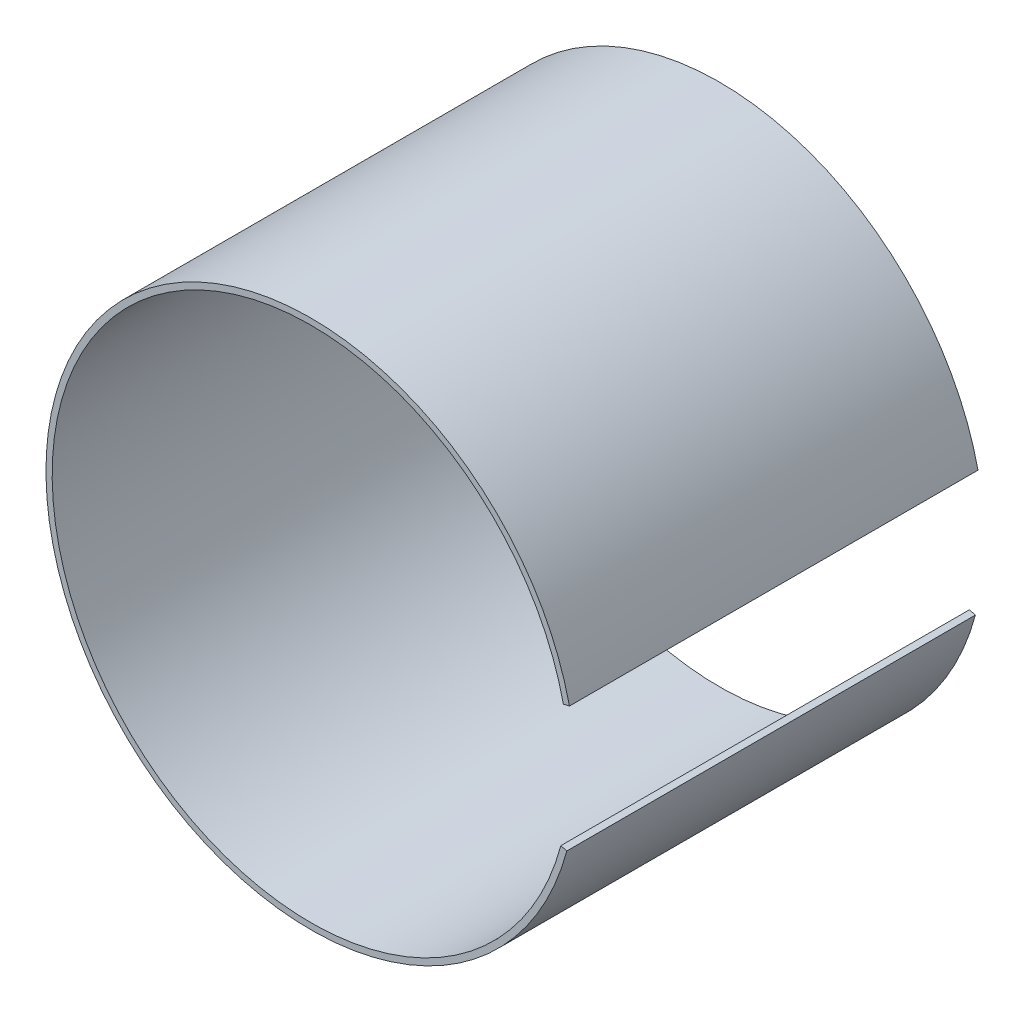
ISO-10303-21;
HEADER;
FILE_DESCRIPTION(('STEP AP214'),'2;1');
FILE_NAME('part.step','',(''),(''),'','','');
FILE_SCHEMA(('AUTOMOTIVE_DESIGN { 1 0 10303 214 1 1 1 1 }'));
ENDSEC;
DATA;
#1=APPLICATION_CONTEXT('core data for automotive mechanical design processes');
#2=APPLICATION_PROTOCOL_DEFINITION('international standard','automotive_design',2000,#1);
#3=PRODUCT_CONTEXT('',#1,'mechanical');
#4=PRODUCT('Part','Part','',(#3));
#5=PRODUCT_RELATED_PRODUCT_CATEGORY('part','',(#4));
#6=PRODUCT_DEFINITION_FORMATION('','',#4);
#7=PRODUCT_DEFINITION_CONTEXT('part definition',#1,'design');
#8=PRODUCT_DEFINITION('design','',#6,#7);
#9=PRODUCT_DEFINITION_SHAPE('','',#8);
#10=(LENGTH_UNIT() NAMED_UNIT(*) SI_UNIT(.MILLI.,.METRE.));
#11=(NAMED_UNIT(*) PLANE_ANGLE_UNIT() SI_UNIT($,.RADIAN.));
#12=(NAMED_UNIT(*) SI_UNIT($,.STERADIAN.) SOLID_ANGLE_UNIT());
#13=UNCERTAINTY_MEASURE_WITH_UNIT(LENGTH_MEASURE(1.E-05),#10,'distance_accuracy_value','');
#14=(GEOMETRIC_REPRESENTATION_CONTEXT(3) GLOBAL_UNCERTAINTY_ASSIGNED_CONTEXT((#13)) GLOBAL_UNIT_ASSIGNED_CONTEXT((#10,
#11,#12)) REPRESENTATION_CONTEXT('',''));
#15=CARTESIAN_POINT('',(0.,0.,0.));
#16=DIRECTION('',(0.,0.,1.));
#17=DIRECTION('',(1.,0.,0.));
#18=AXIS2_PLACEMENT_3D('',#15,#16,#17);
#19=CARTESIAN_POINT('',(0.,0.,33.));
#20=DIRECTION('',(0.,0.,-1.));
#21=DIRECTION('',(-1.,0.,0.));
#22=AXIS2_PLACEMENT_3D('',#19,#20,#21);
#23=CYLINDRICAL_SURFACE('',#22,21.4);
#24=CARTESIAN_POINT('',(0.,0.,0.));
#25=DIRECTION('',(0.,0.,1.));
#26=DIRECTION('',(1.,0.,0.));
#27=AXIS2_PLACEMENT_3D('',#24,#25,#26);
#28=CIRCLE('',#27,21.4);
#29=CARTESIAN_POINT('',(20.8788759541875,4.69388313549147,0.));
#30=VERTEX_POINT('',#29);
#31=CARTESIAN_POINT('',(20.6690367168219,-5.54535131426929,0.));
#32=VERTEX_POINT('',#31);
#33=EDGE_CURVE('E122',#30,#32,#28,.T.);
#34=ORIENTED_EDGE('',*,*,#33,.T.);
#35=DIRECTION('',(0.,0.,-1.));
#36=VECTOR('',#35,1.);
#37=CARTESIAN_POINT('',(20.6690367168219,-5.54535131426929,33.));
#38=LINE('',#37,#36);
#39=CARTESIAN_POINT('',(20.6690367168219,-5.54535131426929,33.));
#40=VERTEX_POINT('',#39);
#41=EDGE_CURVE('E11',#40,#32,#38,.T.);
#42=ORIENTED_EDGE('',*,*,#41,.F.);
#43=CARTESIAN_POINT('',(0.,0.,33.));
#44=DIRECTION('',(0.,0.,1.));
#45=DIRECTION('',(1.,0.,0.));
#46=AXIS2_PLACEMENT_3D('',#43,#44,#45);
#47=CIRCLE('',#46,21.4);
#48=CARTESIAN_POINT('',(20.8788759541875,4.69388313549147,33.));
#49=VERTEX_POINT('',#48);
#50=EDGE_CURVE('E93',#49,#40,#47,.T.);
#51=ORIENTED_EDGE('',*,*,#50,.F.);
#52=DIRECTION('',(0.,0.,-1.));
#53=VECTOR('',#52,1.);
#54=CARTESIAN_POINT('',(20.8788759541875,4.69388313549147,33.));
#55=LINE('',#54,#53);
#56=EDGE_CURVE('E69',#49,#30,#55,.T.);
#57=ORIENTED_EDGE('',*,*,#56,.T.);
#58=EDGE_LOOP('',(#34,#42,#51,#57));
#59=FACE_BOUND('',#58,.T.);
#60=ADVANCED_FACE('F52',(#59),#23,.T.);
#61=CARTESIAN_POINT('',(20.1861152982046,-5.41578703122561,33.));
#62=DIRECTION('',(0.259128566087352,0.965842837234668,0.));
#63=DIRECTION('',(-0.965842837234668,0.259128566087352,0.));
#64=AXIS2_PLACEMENT_3D('',#61,#62,#63);
#65=PLANE('',#64);
#66=DIRECTION('',(0.965842837234668,-0.259128566087352,0.));
#67=VECTOR('',#66,1.);
#68=CARTESIAN_POINT('',(20.1861152982046,-5.41578703122561,0.));
#69=LINE('',#68,#67);
#70=CARTESIAN_POINT('',(20.1861152982046,-5.41578703122561,0.));
#71=VERTEX_POINT('',#70);
#72=EDGE_CURVE('E102',#71,#32,#69,.T.);
#73=ORIENTED_EDGE('',*,*,#72,.F.);
#74=DIRECTION('',(0.,0.,-1.));
#75=VECTOR('',#74,1.);
#76=CARTESIAN_POINT('',(20.1861152982046,-5.41578703122561,33.));
#77=LINE('',#76,#75);
#78=CARTESIAN_POINT('',(20.1861152982046,-5.41578703122561,33.));
#79=VERTEX_POINT('',#78);
#80=EDGE_CURVE('E61',#79,#71,#77,.T.);
#81=ORIENTED_EDGE('',*,*,#80,.F.);
#82=DIRECTION('',(0.965842837234668,-0.259128566087352,0.));
#83=VECTOR('',#82,1.);
#84=CARTESIAN_POINT('',(20.1861152982046,-5.41578703122561,33.));
#85=LINE('',#84,#83);
#86=EDGE_CURVE('E100',#79,#40,#85,.T.);
#87=ORIENTED_EDGE('',*,*,#86,.T.);
#88=ORIENTED_EDGE('',*,*,#41,.T.);
#89=EDGE_LOOP('',(#73,#81,#87,#88));
#90=FACE_BOUND('',#89,.T.);
#91=ADVANCED_FACE('F99',(#90),#65,.T.);
#92=CARTESIAN_POINT('',(0.,0.,33.));
#93=DIRECTION('',(0.,0.,-1.));
#94=DIRECTION('',(-1.,0.,0.));
#95=AXIS2_PLACEMENT_3D('',#92,#93,#94);
#96=CYLINDRICAL_SURFACE('',#95,20.9);
#97=CARTESIAN_POINT('',(0.,0.,0.));
#98=DIRECTION('',(0.,0.,1.));
#99=DIRECTION('',(1.,0.,0.));
#100=AXIS2_PLACEMENT_3D('',#97,#98,#99);
#101=CIRCLE('',#100,20.9);
#102=CARTESIAN_POINT('',(20.3910517496504,4.58421296877438,0.));
#103=VERTEX_POINT('',#102);
#104=EDGE_CURVE('E127',#103,#71,#101,.T.);
#105=ORIENTED_EDGE('',*,*,#104,.F.);
#106=DIRECTION('',(0.,0.,-1.));
#107=VECTOR('',#106,1.);
#108=CARTESIAN_POINT('',(20.3910517496504,4.58421296877438,33.));
#109=LINE('',#108,#107);
#110=CARTESIAN_POINT('',(20.3910517496504,4.58421296877438,33.));
#111=VERTEX_POINT('',#110);
#112=EDGE_CURVE('E82',#111,#103,#109,.T.);
#113=ORIENTED_EDGE('',*,*,#112,.F.);
#114=CARTESIAN_POINT('',(0.,0.,33.));
#115=DIRECTION('',(0.,0.,1.));
#116=DIRECTION('',(1.,0.,0.));
#117=AXIS2_PLACEMENT_3D('',#114,#115,#116);
#118=CIRCLE('',#117,20.9);
#119=EDGE_CURVE('E109',#111,#79,#118,.T.);
#120=ORIENTED_EDGE('',*,*,#119,.T.);
#121=ORIENTED_EDGE('',*,*,#80,.T.);
#122=EDGE_LOOP('',(#105,#113,#120,#121));
#123=FACE_BOUND('',#122,.T.);
#124=ADVANCED_FACE('F112',(#123),#96,.F.);
#125=CARTESIAN_POINT('',(20.8788759541875,4.69388313549147,33.));
#126=DIRECTION('',(0.219340333434182,-0.975648409074182,0.));
#127=DIRECTION('',(0.975648409074182,0.219340333434182,0.));
#128=AXIS2_PLACEMENT_3D('',#125,#126,#127);
#129=PLANE('',#128);
#130=DIRECTION('',(-0.975648409074182,-0.219340333434182,0.));
#131=VECTOR('',#130,1.);
#132=CARTESIAN_POINT('',(20.8788759541875,4.69388313549147,0.));
#133=LINE('',#132,#131);
#134=EDGE_CURVE('E130',#30,#103,#133,.T.);
#135=ORIENTED_EDGE('',*,*,#134,.F.);
#136=ORIENTED_EDGE('',*,*,#56,.F.);
#137=DIRECTION('',(-0.975648409074182,-0.219340333434182,0.));
#138=VECTOR('',#137,1.);
#139=CARTESIAN_POINT('',(20.8788759541875,4.69388313549147,33.));
#140=LINE('',#139,#138);
#141=EDGE_CURVE('E114',#49,#111,#140,.T.);
#142=ORIENTED_EDGE('',*,*,#141,.T.);
#143=ORIENTED_EDGE('',*,*,#112,.T.);
#144=EDGE_LOOP('',(#135,#136,#142,#143));
#145=FACE_BOUND('',#144,.T.);
#146=ADVANCED_FACE('F150',(#145),#129,.T.);
#147=CARTESIAN_POINT('',(0.,0.,33.));
#148=DIRECTION('',(0.,0.,1.));
#149=DIRECTION('',(1.,0.,0.));
#150=AXIS2_PLACEMENT_3D('',#147,#148,#149);
#151=PLANE('',#150);
#152=ORIENTED_EDGE('',*,*,#50,.T.);
#153=ORIENTED_EDGE('',*,*,#86,.F.);
#154=ORIENTED_EDGE('',*,*,#119,.F.);
#155=ORIENTED_EDGE('',*,*,#141,.F.);
#156=EDGE_LOOP('',(#152,#153,#154,#155));
#157=FACE_BOUND('',#156,.T.);
#158=ADVANCED_FACE('F108',(#157),#151,.T.);
#159=CARTESIAN_POINT('',(0.,0.,0.));
#160=DIRECTION('',(0.,0.,1.));
#161=DIRECTION('',(1.,0.,0.));
#162=AXIS2_PLACEMENT_3D('',#159,#160,#161);
#163=PLANE('',#162);
#164=ORIENTED_EDGE('',*,*,#33,.F.);
#165=ORIENTED_EDGE('',*,*,#134,.T.);
#166=ORIENTED_EDGE('',*,*,#104,.T.);
#167=ORIENTED_EDGE('',*,*,#72,.T.);
#168=EDGE_LOOP('',(#164,#165,#166,#167));
#169=FACE_BOUND('',#168,.T.);
#170=ADVANCED_FACE('F149',(#169),#163,.F.);
#171=CLOSED_SHELL('',(#60,#91,#124,#146,#158,#170));
#172=MANIFOLD_SOLID_BREP('B2',#171);
#173=ADVANCED_BREP_SHAPE_REPRESENTATION('',(#18,#172),#14);
#174=SHAPE_DEFINITION_REPRESENTATION(#9,#173);
ENDSEC;
END-ISO-10303-21;
